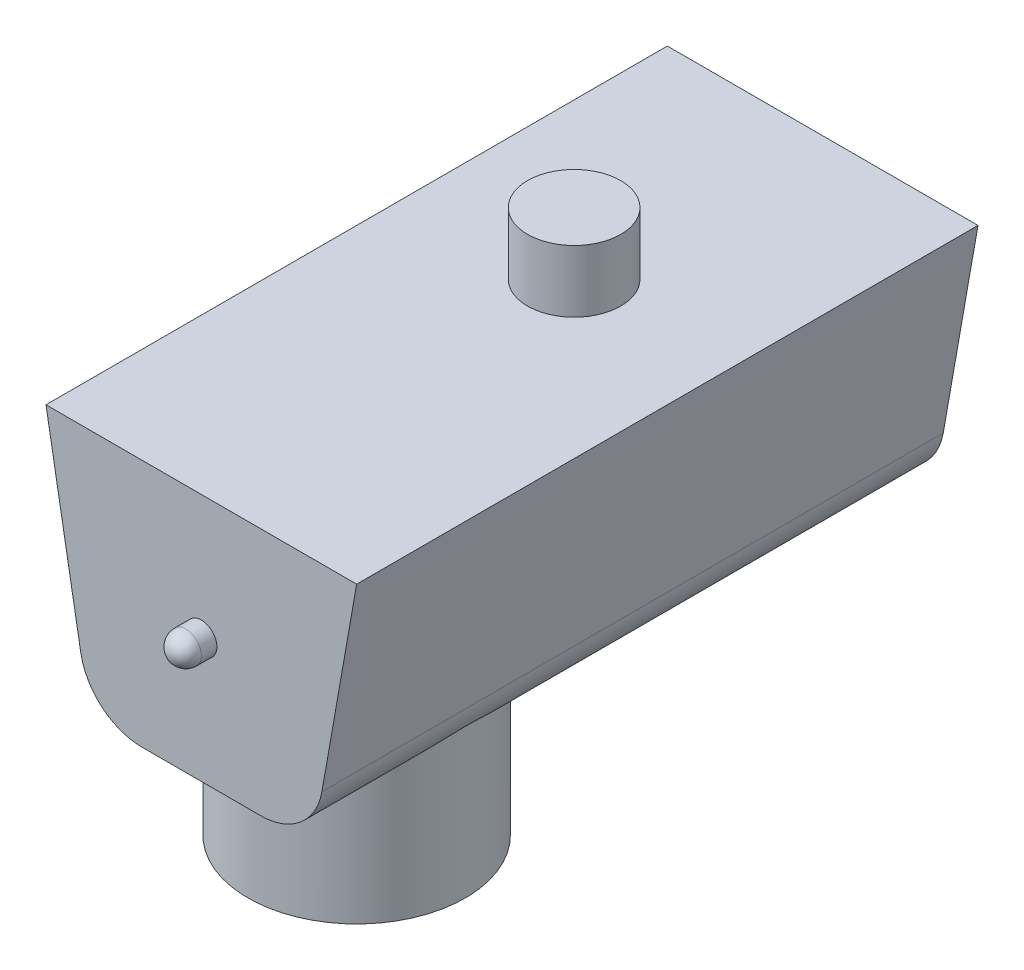
ISO-10303-21;
HEADER;
FILE_DESCRIPTION(('STEP AP214'),'2;1');
FILE_NAME('part.step','',(''),(''),'','','');
FILE_SCHEMA(('AUTOMOTIVE_DESIGN { 1 0 10303 214 1 1 1 1 }'));
ENDSEC;
DATA;
#1=APPLICATION_CONTEXT('core data for automotive mechanical design processes');
#2=APPLICATION_PROTOCOL_DEFINITION('international standard','automotive_design',2000,#1);
#3=PRODUCT_CONTEXT('',#1,'mechanical');
#4=PRODUCT('Part','Part','',(#3));
#5=PRODUCT_RELATED_PRODUCT_CATEGORY('part','',(#4));
#6=PRODUCT_DEFINITION_FORMATION('','',#4);
#7=PRODUCT_DEFINITION_CONTEXT('part definition',#1,'design');
#8=PRODUCT_DEFINITION('design','',#6,#7);
#9=PRODUCT_DEFINITION_SHAPE('','',#8);
#10=(LENGTH_UNIT() NAMED_UNIT(*) SI_UNIT(.MILLI.,.METRE.));
#11=(NAMED_UNIT(*) PLANE_ANGLE_UNIT() SI_UNIT($,.RADIAN.));
#12=(NAMED_UNIT(*) SI_UNIT($,.STERADIAN.) SOLID_ANGLE_UNIT());
#13=UNCERTAINTY_MEASURE_WITH_UNIT(LENGTH_MEASURE(1.E-05),#10,'distance_accuracy_value','');
#14=(GEOMETRIC_REPRESENTATION_CONTEXT(3) GLOBAL_UNCERTAINTY_ASSIGNED_CONTEXT((#13)) GLOBAL_UNIT_ASSIGNED_CONTEXT((#10,
#11,#12)) REPRESENTATION_CONTEXT('',''));
#15=CARTESIAN_POINT('',(0.,0.,0.));
#16=DIRECTION('',(0.,0.,1.));
#17=DIRECTION('',(1.,0.,0.));
#18=AXIS2_PLACEMENT_3D('',#15,#16,#17);
#19=CARTESIAN_POINT('',(0.,-4.,1.));
#20=DIRECTION('',(0.,0.,-1.));
#21=DIRECTION('',(-1.,0.,0.));
#22=AXIS2_PLACEMENT_3D('',#19,#20,#21);
#23=CYLINDRICAL_SURFACE('',#22,0.5);
#24=CARTESIAN_POINT('',(0.,-4.,0.5));
#25=DIRECTION('',(0.,0.,-1.));
#26=DIRECTION('',(-1.,0.,0.));
#27=AXIS2_PLACEMENT_3D('',#24,#25,#26);
#28=CIRCLE('',#27,0.5);
#29=CARTESIAN_POINT('',(-0.499999999999999,-4.,0.5));
#30=VERTEX_POINT('',#29);
#31=EDGE_CURVE('E11',#30,#30,#28,.T.);
#32=ORIENTED_EDGE('',*,*,#31,.T.);
#33=EDGE_LOOP('',(#32));
#34=FACE_BOUND('',#33,.T.);
#35=CARTESIAN_POINT('',(0.,-4.,0.));
#36=DIRECTION('',(0.,0.,1.));
#37=DIRECTION('',(1.,0.,0.));
#38=AXIS2_PLACEMENT_3D('',#35,#36,#37);
#39=CIRCLE('',#38,0.5);
#40=CARTESIAN_POINT('',(0.500000000000001,-4.,0.));
#41=VERTEX_POINT('',#40);
#42=EDGE_CURVE('E56',#41,#41,#39,.T.);
#43=ORIENTED_EDGE('',*,*,#42,.T.);
#44=EDGE_LOOP('',(#43));
#45=FACE_BOUND('',#44,.T.);
#46=ADVANCED_FACE('F49',(#34,#45),#23,.T.);
#47=CARTESIAN_POINT('',(0.,0.,0.));
#48=DIRECTION('',(0.,0.,1.));
#49=DIRECTION('',(1.,0.,0.));
#50=AXIS2_PLACEMENT_3D('',#47,#48,#49);
#51=PLANE('',#50);
#52=ORIENTED_EDGE('',*,*,#42,.F.);
#53=EDGE_LOOP('',(#52));
#54=FACE_BOUND('',#53,.T.);
#55=ADVANCED_FACE('F63',(#54),#51,.F.);
#56=CARTESIAN_POINT('',(0.,-4.,0.5));
#57=DIRECTION('',(0.,0.,1.));
#58=DIRECTION('',(1.,0.,0.));
#59=AXIS2_PLACEMENT_3D('',#56,#57,#58);
#60=SPHERICAL_SURFACE('',#59,0.5);
#61=ORIENTED_EDGE('',*,*,#31,.F.);
#62=EDGE_LOOP('',(#61));
#63=FACE_BOUND('',#62,.T.);
#64=ADVANCED_FACE('F51',(#63),#60,.T.);
#65=CLOSED_SHELL('',(#46,#55,#64));
#66=MANIFOLD_SOLID_BREP('B2',#65);
#67=CARTESIAN_POINT('',(-1.91118489197773,-8.,-20.));
#68=DIRECTION('',(0.,-1.,0.));
#69=DIRECTION('',(0.,0.,-1.));
#70=AXIS2_PLACEMENT_3D('',#67,#68,#69);
#71=PLANE('',#70);
#72=CARTESIAN_POINT('',(0.,-8.,-5.));
#73=DIRECTION('',(0.,-1.,0.));
#74=DIRECTION('',(0.,0.,-1.));
#75=AXIS2_PLACEMENT_3D('',#72,#73,#74);
#76=CIRCLE('',#75,3.5);
#77=CARTESIAN_POINT('',(1.91118489197773,-8.,-2.06787239215684));
#78=VERTEX_POINT('',#77);
#79=CARTESIAN_POINT('',(-1.91118489197773,-8.,-2.06787239215684));
#80=VERTEX_POINT('',#79);
#81=EDGE_CURVE('E111',#78,#80,#76,.T.);
#82=ORIENTED_EDGE('',*,*,#81,.F.);
#83=DIRECTION('',(0.,0.,1.));
#84=VECTOR('',#83,1.);
#85=CARTESIAN_POINT('',(1.91118489197773,-8.,-20.));
#86=LINE('',#85,#84);
#87=CARTESIAN_POINT('',(1.91118489197773,-8.,0.));
#88=VERTEX_POINT('',#87);
#89=EDGE_CURVE('E196',#78,#88,#86,.T.);
#90=ORIENTED_EDGE('',*,*,#89,.T.);
#91=DIRECTION('',(1.,0.,0.));
#92=VECTOR('',#91,1.);
#93=CARTESIAN_POINT('',(-1.91118489197773,-8.,0.));
#94=LINE('',#93,#92);
#95=CARTESIAN_POINT('',(-1.91118489197773,-8.,0.));
#96=VERTEX_POINT('',#95);
#97=EDGE_CURVE('E285',#96,#88,#94,.T.);
#98=ORIENTED_EDGE('',*,*,#97,.F.);
#99=DIRECTION('',(0.,0.,1.));
#100=VECTOR('',#99,1.);
#101=CARTESIAN_POINT('',(-1.91118489197773,-8.,-20.));
#102=LINE('',#101,#100);
#103=EDGE_CURVE('E194',#80,#96,#102,.T.);
#104=ORIENTED_EDGE('',*,*,#103,.F.);
#105=EDGE_LOOP('',(#82,#90,#98,#104));
#106=FACE_BOUND('',#105,.T.);
#107=ADVANCED_FACE('F90',(#106),#71,.T.);
#108=CARTESIAN_POINT('',(3.88080039800216,-6.34729635533384,-20.));
#109=DIRECTION('',(0.984807753012209,-0.173648177666927,0.));
#110=DIRECTION('',(0.173648177666927,0.984807753012209,0.));
#111=AXIS2_PLACEMENT_3D('',#108,#109,#110);
#112=PLANE('',#111);
#113=DIRECTION('',(0.173648177666927,0.984807753012209,0.));
#114=VECTOR('',#113,1.);
#115=CARTESIAN_POINT('',(3.88080039800216,-6.34729635533384,0.));
#116=LINE('',#115,#114);
#117=CARTESIAN_POINT('',(3.88080039800216,-6.34729635533384,0.));
#118=VERTEX_POINT('',#117);
#119=CARTESIAN_POINT('',(5.,0.,0.));
#120=VERTEX_POINT('',#119);
#121=EDGE_CURVE('E253',#118,#120,#116,.T.);
#122=ORIENTED_EDGE('',*,*,#121,.F.);
#123=DIRECTION('',(0.,0.,1.));
#124=VECTOR('',#123,1.);
#125=CARTESIAN_POINT('',(3.88080039800216,-6.34729635533384,-20.));
#126=LINE('',#125,#124);
#127=CARTESIAN_POINT('',(3.88080039800216,-6.34729635533384,-20.));
#128=VERTEX_POINT('',#127);
#129=EDGE_CURVE('E183',#128,#118,#126,.T.);
#130=ORIENTED_EDGE('',*,*,#129,.F.);
#131=DIRECTION('',(0.173648177666927,0.984807753012209,0.));
#132=VECTOR('',#131,1.);
#133=CARTESIAN_POINT('',(3.88080039800216,-6.34729635533384,-20.));
#134=LINE('',#133,#132);
#135=CARTESIAN_POINT('',(5.,0.,-20.));
#136=VERTEX_POINT('',#135);
#137=EDGE_CURVE('E256',#128,#136,#134,.T.);
#138=ORIENTED_EDGE('',*,*,#137,.T.);
#139=DIRECTION('',(0.,0.,1.));
#140=VECTOR('',#139,1.);
#141=CARTESIAN_POINT('',(5.,0.,-20.));
#142=LINE('',#141,#140);
#143=EDGE_CURVE('E205',#136,#120,#142,.T.);
#144=ORIENTED_EDGE('',*,*,#143,.T.);
#145=EDGE_LOOP('',(#122,#130,#138,#144));
#146=FACE_BOUND('',#145,.T.);
#147=ADVANCED_FACE('F92',(#146),#112,.T.);
#148=CARTESIAN_POINT('',(1.91118489197774,-6.,-20.));
#149=DIRECTION('',(0.,0.,1.));
#150=DIRECTION('',(1.,0.,0.));
#151=AXIS2_PLACEMENT_3D('',#148,#149,#150);
#152=CYLINDRICAL_SURFACE('',#151,2.);
#153=CARTESIAN_POINT('',(1.91118489197773,-8.,-7.93212760784317));
#154=CARTESIAN_POINT('',(1.98358799506988,-7.99999929424011,-7.8849646808693));
#155=CARTESIAN_POINT('',(2.05412557252914,-7.99607170451609,-7.83513982459404));
#156=CARTESIAN_POINT('',(2.19074387768691,-7.98155247196233,-7.73092554150598));
#157=CARTESIAN_POINT('',(2.25683585304358,-7.97097840573854,-7.67654848074));
#158=CARTESIAN_POINT('',(2.38344807204189,-7.9445058545928,-7.564421439919));
#159=CARTESIAN_POINT('',(2.44402639521548,-7.9286738190078,-7.50672063358744));
#160=CARTESIAN_POINT('',(2.56032747071847,-7.89270206334381,-7.38781125262578));
#161=CARTESIAN_POINT('',(2.61604657190707,-7.8725591427248,-7.32660009665203));
#162=CARTESIAN_POINT('',(2.73328234191226,-7.82453861845805,-7.18837052087008));
#163=CARTESIAN_POINT('',(2.79368299904256,-7.79592085985095,-7.1106639522529));
#164=CARTESIAN_POINT('',(2.90723045284817,-7.73551987853734,-6.95130426712442));
#165=CARTESIAN_POINT('',(2.96037630636037,-7.70373624517754,-6.86965063933938));
#166=CARTESIAN_POINT('',(3.05972330760307,-7.63841630169307,-6.702239746868));
#167=CARTESIAN_POINT('',(3.10588577523502,-7.6048715235807,-6.61646286281092));
#168=CARTESIAN_POINT('',(3.19091624615944,-7.5379274049331,-6.44136059621658));
#169=CARTESIAN_POINT('',(3.22978601116677,-7.50452803118146,-6.3520360770237));
#170=CARTESIAN_POINT('',(3.31795178863783,-7.42342783755891,-6.12376422163606));
#171=CARTESIAN_POINT('',(3.36261703828588,-7.37701118021476,-5.98251378491226));
#172=CARTESIAN_POINT('',(3.43404785502108,-7.29760433198984,-5.69240350088643));
#173=CARTESIAN_POINT('',(3.46090586880833,-7.26454515091273,-5.54358734208319));
#174=CARTESIAN_POINT('',(3.49190487007958,-7.22550477168379,-5.26835191435162));
#175=CARTESIAN_POINT('',(3.49933512104774,-7.21563882580685,-5.14289739868689));
#176=CARTESIAN_POINT('',(3.50057875700142,-7.21401413891001,-4.89182582332128));
#177=CARTESIAN_POINT('',(3.49439575283645,-7.22225059631494,-4.76620881555346));
#178=CARTESIAN_POINT('',(3.46569738697379,-7.25861691282281,-4.48669892121598));
#179=CARTESIAN_POINT('',(3.43939346727387,-7.29131479895575,-4.33383469672536));
#180=CARTESIAN_POINT('',(3.36811342208995,-7.37119449467568,-4.03587321645681));
#181=CARTESIAN_POINT('',(3.32302335880622,-7.41846421935747,-3.89082956109688));
#182=CARTESIAN_POINT('',(3.23258152838831,-7.50214265106308,-3.65430062606489));
#183=CARTESIAN_POINT('',(3.19190289651856,-7.53720498274705,-3.56049167957574));
#184=CARTESIAN_POINT('',(3.10251168768437,-7.60747218833978,-3.37677342374652));
#185=CARTESIAN_POINT('',(3.05379649889373,-7.64267710494742,-3.28686539421508));
#186=CARTESIAN_POINT('',(2.9486500025673,-7.71101721297381,-3.11165763123688));
#187=CARTESIAN_POINT('',(2.89226643680235,-7.7441634940457,-3.02633361610787));
#188=CARTESIAN_POINT('',(2.77151789442627,-7.80677898177201,-2.86008557708139));
#189=CARTESIAN_POINT('',(2.70715535492474,-7.8362493057258,-2.77916022046136));
#190=CARTESIAN_POINT('',(2.58719089252604,-7.88310630567182,-2.64147912696994));
#191=CARTESIAN_POINT('',(2.53328828725158,-7.90168633611877,-2.58364737280702));
#192=CARTESIAN_POINT('',(2.4210854081335,-7.93479214658057,-2.4712357137426));
#193=CARTESIAN_POINT('',(2.36278831213217,-7.94932082124396,-2.41665350911807));
#194=CARTESIAN_POINT('',(2.241261842715,-7.97355774568699,-2.31051777160011));
#195=CARTESIAN_POINT('',(2.17798242512052,-7.98320714867982,-2.2590075292425));
#196=CARTESIAN_POINT('',(2.04743108283241,-7.99643552394319,-2.16014299038981));
#197=CARTESIAN_POINT('',(1.98014997535747,-7.99999992920589,-2.11279892339922));
#198=CARTESIAN_POINT('',(1.91118489197773,-8.00000000000001,-2.06787239215684));
#199=B_SPLINE_CURVE_WITH_KNOTS('',3,(#153,#154,#155,#156,#157,#158,#159,#160,#161,#162,#163,
#164,#165,#166,#167,#168,#169,#170,#171,#172,#173,#174,#175,#176,#177,#178,#179,#180,#181,#182,
#183,#184,#185,#186,#187,#188,#189,#190,#191,#192,#193,#194,#195,#196,#197,#198),.UNSPECIFIED.,
.F.,.F.,(4,2,2,2,2,2,2,2,2,2,2,2,2,2,2,2,2,2,2,2,2,2,4),(0.,0.25892030118102,0.517158751901072,
0.772250506087775,1.02753230971939,1.33458757432497,1.6416827198096,1.95042101869072,
2.25908463865253,2.72344399261823,3.18537333311091,3.56163484346092,3.93779656430451,
4.4106182175377,4.88635026511816,5.21030344006054,5.5343621057374,5.85648847322114,
6.17851669125361,6.42189869248425,6.66510635180954,6.91118116715639,7.15784424453554),.UNSPECIFIED.);
#200=CARTESIAN_POINT('',(1.91118489197773,-8.,-7.93212760784317));
#201=VERTEX_POINT('',#200);
#202=EDGE_CURVE('E118',#201,#78,#199,.T.);
#203=ORIENTED_EDGE('',*,*,#202,.F.);
#204=CARTESIAN_POINT('',(1.91118489197773,-8.,-20.));
#205=VERTEX_POINT('',#204);
#206=EDGE_CURVE('E200',#205,#201,#86,.T.);
#207=ORIENTED_EDGE('',*,*,#206,.F.);
#208=CARTESIAN_POINT('',(1.91118489197774,-6.,-20.));
#209=DIRECTION('',(0.,0.,1.));
#210=DIRECTION('',(1.,0.,0.));
#211=AXIS2_PLACEMENT_3D('',#208,#209,#210);
#212=CIRCLE('',#211,2.);
#213=EDGE_CURVE('E206',#205,#128,#212,.T.);
#214=ORIENTED_EDGE('',*,*,#213,.T.);
#215=ORIENTED_EDGE('',*,*,#129,.T.);
#216=CARTESIAN_POINT('',(1.91118489197774,-6.,0.));
#217=DIRECTION('',(0.,0.,1.));
#218=DIRECTION('',(1.,0.,0.));
#219=AXIS2_PLACEMENT_3D('',#216,#217,#218);
#220=CIRCLE('',#219,2.);
#221=EDGE_CURVE('E260',#88,#118,#220,.T.);
#222=ORIENTED_EDGE('',*,*,#221,.F.);
#223=ORIENTED_EDGE('',*,*,#89,.F.);
#224=EDGE_LOOP('',(#203,#207,#214,#215,#222,#223));
#225=FACE_BOUND('',#224,.T.);
#226=ADVANCED_FACE('F235',(#225),#152,.T.);
#227=CARTESIAN_POINT('',(-1.91118489197773,-8.,-7.93212760784317));
#228=VERTEX_POINT('',#227);
#229=EDGE_CURVE('E232',#228,#201,#76,.T.);
#230=ORIENTED_EDGE('',*,*,#229,.F.);
#231=CARTESIAN_POINT('',(-1.91118489197773,-8.,-20.));
#232=VERTEX_POINT('',#231);
#233=EDGE_CURVE('E193',#232,#228,#102,.T.);
#234=ORIENTED_EDGE('',*,*,#233,.F.);
#235=DIRECTION('',(1.,0.,0.));
#236=VECTOR('',#235,1.);
#237=CARTESIAN_POINT('',(-1.91118489197773,-8.,-20.));
#238=LINE('',#237,#236);
#239=EDGE_CURVE('E269',#232,#205,#238,.T.);
#240=ORIENTED_EDGE('',*,*,#239,.T.);
#241=ORIENTED_EDGE('',*,*,#206,.T.);
#242=EDGE_LOOP('',(#230,#234,#240,#241));
#243=FACE_BOUND('',#242,.T.);
#244=ADVANCED_FACE('F239',(#243),#71,.T.);
#245=CARTESIAN_POINT('',(-1.91118489197774,-6.,-20.));
#246=DIRECTION('',(0.,0.,1.));
#247=DIRECTION('',(1.,0.,0.));
#248=AXIS2_PLACEMENT_3D('',#245,#246,#247);
#249=CYLINDRICAL_SURFACE('',#248,2.);
#250=CARTESIAN_POINT('',(-1.91118489197773,-8.,-2.06787239215684));
#251=CARTESIAN_POINT('',(-1.98358799506988,-7.99999929424011,-2.1150353191307));
#252=CARTESIAN_POINT('',(-2.05412557252914,-7.99607170451609,-2.16486017540597));
#253=CARTESIAN_POINT('',(-2.19074387768691,-7.98155247196233,-2.26907445849403));
#254=CARTESIAN_POINT('',(-2.25683585304358,-7.97097840573854,-2.32345151926));
#255=CARTESIAN_POINT('',(-2.38344807204189,-7.9445058545928,-2.435578560081));
#256=CARTESIAN_POINT('',(-2.44402639521548,-7.9286738190078,-2.49327936641257));
#257=CARTESIAN_POINT('',(-2.56032747071847,-7.89270206334381,-2.61218874737423));
#258=CARTESIAN_POINT('',(-2.61604657190707,-7.8725591427248,-2.67339990334798));
#259=CARTESIAN_POINT('',(-2.73328234191226,-7.82453861845805,-2.81162947912993));
#260=CARTESIAN_POINT('',(-2.79368299904256,-7.79592085985095,-2.8893360477471));
#261=CARTESIAN_POINT('',(-2.90723045284817,-7.73551987853734,-3.04869573287558));
#262=CARTESIAN_POINT('',(-2.96037630636037,-7.70373624517754,-3.13034936066062));
#263=CARTESIAN_POINT('',(-3.05972330760307,-7.63841630169307,-3.297760253132));
#264=CARTESIAN_POINT('',(-3.10588577523503,-7.6048715235807,-3.38353713718908));
#265=CARTESIAN_POINT('',(-3.19091624615944,-7.5379274049331,-3.55863940378342));
#266=CARTESIAN_POINT('',(-3.22978601116677,-7.50452803118146,-3.64796392297631));
#267=CARTESIAN_POINT('',(-3.31795178863783,-7.42342783755891,-3.87623577836394));
#268=CARTESIAN_POINT('',(-3.36261703828588,-7.37701118021476,-4.01748621508774));
#269=CARTESIAN_POINT('',(-3.43404785502108,-7.29760433198984,-4.30759649911358));
#270=CARTESIAN_POINT('',(-3.46090586880833,-7.26454515091273,-4.45641265791681));
#271=CARTESIAN_POINT('',(-3.49190487007958,-7.2255047716838,-4.73164808564839));
#272=CARTESIAN_POINT('',(-3.49933512104774,-7.21563882580685,-4.85710260131312));
#273=CARTESIAN_POINT('',(-3.50057875700142,-7.21401413891001,-5.10817417667872));
#274=CARTESIAN_POINT('',(-3.49439575283645,-7.22225059631494,-5.23379118444655));
#275=CARTESIAN_POINT('',(-3.46569738697379,-7.25861691282281,-5.51330107878402));
#276=CARTESIAN_POINT('',(-3.43939346727387,-7.29131479895576,-5.66616530327465));
#277=CARTESIAN_POINT('',(-3.36811342208995,-7.37119449467569,-5.9641267835432));
#278=CARTESIAN_POINT('',(-3.32302335880622,-7.41846421935748,-6.10917043890313));
#279=CARTESIAN_POINT('',(-3.23258152838831,-7.50214265106308,-6.34569937393512));
#280=CARTESIAN_POINT('',(-3.19190289651855,-7.53720498274706,-6.43950832042427));
#281=CARTESIAN_POINT('',(-3.10251168768437,-7.60747218833979,-6.62322657625349));
#282=CARTESIAN_POINT('',(-3.05379649889373,-7.64267710494743,-6.71313460578493));
#283=CARTESIAN_POINT('',(-2.94865000256729,-7.71101721297382,-6.88834236876313));
#284=CARTESIAN_POINT('',(-2.89226643680235,-7.7441634940457,-6.97366638389214));
#285=CARTESIAN_POINT('',(-2.77151789442627,-7.80677898177201,-7.13991442291862));
#286=CARTESIAN_POINT('',(-2.70715535492474,-7.8362493057258,-7.22083977953865));
#287=CARTESIAN_POINT('',(-2.58719089252604,-7.88310630567182,-7.35852087303007));
#288=CARTESIAN_POINT('',(-2.53328828725158,-7.90168633611877,-7.41635262719299));
#289=CARTESIAN_POINT('',(-2.42108540813349,-7.93479214658057,-7.5287642862574));
#290=CARTESIAN_POINT('',(-2.36278831213217,-7.94932082124396,-7.58334649088194));
#291=CARTESIAN_POINT('',(-2.241261842715,-7.97355774568699,-7.68948222839989));
#292=CARTESIAN_POINT('',(-2.17798242512052,-7.98320714867982,-7.74099247075751));
#293=CARTESIAN_POINT('',(-2.04743108283241,-7.99643552394318,-7.83985700961019));
#294=CARTESIAN_POINT('',(-1.98014997535748,-7.99999992920589,-7.88720107660078));
#295=CARTESIAN_POINT('',(-1.91118489197773,-8.00000000000001,-7.93212760784317));
#296=B_SPLINE_CURVE_WITH_KNOTS('',3,(#250,#251,#252,#253,#254,#255,#256,#257,#258,#259,#260,
#261,#262,#263,#264,#265,#266,#267,#268,#269,#270,#271,#272,#273,#274,#275,#276,#277,#278,#279,
#280,#281,#282,#283,#284,#285,#286,#287,#288,#289,#290,#291,#292,#293,#294,#295),.UNSPECIFIED.,
.F.,.F.,(4,2,2,2,2,2,2,2,2,2,2,2,2,2,2,2,2,2,2,2,2,2,4),(0.,0.258920301181019,0.517158751901072,
0.772250506087775,1.02753230971939,1.33458757432497,1.6416827198096,1.95042101869072,
2.25908463865253,2.72344399261823,3.18537333311091,3.56163484346092,3.93779656430451,
4.41061821753771,4.88635026511816,5.21030344006055,5.5343621057374,5.85648847322115,
6.17851669125361,6.42189869248425,6.66510635180954,6.91118116715638,7.15784424453554),.UNSPECIFIED.);
#297=EDGE_CURVE('E47',#80,#228,#296,.T.);
#298=ORIENTED_EDGE('',*,*,#297,.F.);
#299=ORIENTED_EDGE('',*,*,#103,.T.);
#300=CARTESIAN_POINT('',(-1.91118489197774,-6.,0.));
#301=DIRECTION('',(0.,0.,1.));
#302=DIRECTION('',(1.,0.,0.));
#303=AXIS2_PLACEMENT_3D('',#300,#301,#302);
#304=CIRCLE('',#303,2.);
#305=CARTESIAN_POINT('',(-3.88080039800216,-6.34729635533384,0.));
#306=VERTEX_POINT('',#305);
#307=EDGE_CURVE('E282',#306,#96,#304,.T.);
#308=ORIENTED_EDGE('',*,*,#307,.F.);
#309=DIRECTION('',(0.,0.,1.));
#310=VECTOR('',#309,1.);
#311=CARTESIAN_POINT('',(-3.88080039800216,-6.34729635533384,-20.));
#312=LINE('',#311,#310);
#313=CARTESIAN_POINT('',(-3.88080039800216,-6.34729635533384,-20.));
#314=VERTEX_POINT('',#313);
#315=EDGE_CURVE('E197',#314,#306,#312,.T.);
#316=ORIENTED_EDGE('',*,*,#315,.F.);
#317=CARTESIAN_POINT('',(-1.91118489197774,-6.,-20.));
#318=DIRECTION('',(0.,0.,1.));
#319=DIRECTION('',(1.,0.,0.));
#320=AXIS2_PLACEMENT_3D('',#317,#318,#319);
#321=CIRCLE('',#320,2.);
#322=EDGE_CURVE('E266',#314,#232,#321,.T.);
#323=ORIENTED_EDGE('',*,*,#322,.T.);
#324=ORIENTED_EDGE('',*,*,#233,.T.);
#325=EDGE_LOOP('',(#298,#299,#308,#316,#323,#324));
#326=FACE_BOUND('',#325,.T.);
#327=ADVANCED_FACE('F212',(#326),#249,.T.);
#328=CARTESIAN_POINT('',(-5.,0.,-20.));
#329=DIRECTION('',(-0.984807753012209,-0.173648177666927,0.));
#330=DIRECTION('',(0.173648177666927,-0.984807753012209,0.));
#331=AXIS2_PLACEMENT_3D('',#328,#329,#330);
#332=PLANE('',#331);
#333=DIRECTION('',(0.173648177666927,-0.984807753012209,0.));
#334=VECTOR('',#333,1.);
#335=CARTESIAN_POINT('',(-5.,0.,0.));
#336=LINE('',#335,#334);
#337=CARTESIAN_POINT('',(-5.,0.,0.));
#338=VERTEX_POINT('',#337);
#339=EDGE_CURVE('E279',#338,#306,#336,.T.);
#340=ORIENTED_EDGE('',*,*,#339,.F.);
#341=DIRECTION('',(0.,0.,1.));
#342=VECTOR('',#341,1.);
#343=CARTESIAN_POINT('',(-5.,0.,-20.));
#344=LINE('',#343,#342);
#345=CARTESIAN_POINT('',(-5.,0.,-20.));
#346=VERTEX_POINT('',#345);
#347=EDGE_CURVE('E203',#346,#338,#344,.T.);
#348=ORIENTED_EDGE('',*,*,#347,.F.);
#349=DIRECTION('',(0.173648177666927,-0.984807753012209,0.));
#350=VECTOR('',#349,1.);
#351=CARTESIAN_POINT('',(-5.,0.,-20.));
#352=LINE('',#351,#350);
#353=EDGE_CURVE('E263',#346,#314,#352,.T.);
#354=ORIENTED_EDGE('',*,*,#353,.T.);
#355=ORIENTED_EDGE('',*,*,#315,.T.);
#356=EDGE_LOOP('',(#340,#348,#354,#355));
#357=FACE_BOUND('',#356,.T.);
#358=ADVANCED_FACE('F314',(#357),#332,.T.);
#359=CARTESIAN_POINT('',(-5.,0.,-20.));
#360=DIRECTION('',(0.,1.,0.));
#361=DIRECTION('',(-1.,0.,0.));
#362=AXIS2_PLACEMENT_3D('',#359,#360,#361);
#363=PLANE('',#362);
#364=CARTESIAN_POINT('',(0.,0.,-12.));
#365=DIRECTION('',(0.,1.,0.));
#366=DIRECTION('',(-1.,0.,0.));
#367=AXIS2_PLACEMENT_3D('',#364,#365,#366);
#368=CIRCLE('',#367,1.5);
#369=CARTESIAN_POINT('',(-1.5,0.,-12.));
#370=VERTEX_POINT('',#369);
#371=EDGE_CURVE('E351',#370,#370,#368,.T.);
#372=ORIENTED_EDGE('',*,*,#371,.F.);
#373=EDGE_LOOP('',(#372));
#374=FACE_BOUND('',#373,.T.);
#375=DIRECTION('',(-1.,0.,0.));
#376=VECTOR('',#375,1.);
#377=CARTESIAN_POINT('',(-5.,0.,0.));
#378=LINE('',#377,#376);
#379=EDGE_CURVE('E276',#120,#338,#378,.T.);
#380=ORIENTED_EDGE('',*,*,#379,.F.);
#381=ORIENTED_EDGE('',*,*,#143,.F.);
#382=DIRECTION('',(-1.,0.,0.));
#383=VECTOR('',#382,1.);
#384=CARTESIAN_POINT('',(-5.,0.,-20.));
#385=LINE('',#384,#383);
#386=EDGE_CURVE('E259',#136,#346,#385,.T.);
#387=ORIENTED_EDGE('',*,*,#386,.T.);
#388=ORIENTED_EDGE('',*,*,#347,.T.);
#389=EDGE_LOOP('',(#380,#381,#387,#388));
#390=FACE_BOUND('',#389,.T.);
#391=ADVANCED_FACE('F312',(#374,#390),#363,.T.);
#392=CARTESIAN_POINT('',(-1.91118489197774,-6.,-20.));
#393=DIRECTION('',(0.,0.,1.));
#394=DIRECTION('',(1.,0.,0.));
#395=AXIS2_PLACEMENT_3D('',#392,#393,#394);
#396=PLANE('',#395);
#397=CARTESIAN_POINT('',(0.,-4.,-20.));
#398=DIRECTION('',(0.,0.,1.));
#399=DIRECTION('',(1.,0.,0.));
#400=AXIS2_PLACEMENT_3D('',#397,#398,#399);
#401=CIRCLE('',#400,0.5);
#402=CARTESIAN_POINT('',(0.500000000000001,-4.,-20.));
#403=VERTEX_POINT('',#402);
#404=EDGE_CURVE('E250',#403,#403,#401,.T.);
#405=ORIENTED_EDGE('',*,*,#404,.T.);
#406=EDGE_LOOP('',(#405));
#407=FACE_BOUND('',#406,.T.);
#408=ORIENTED_EDGE('',*,*,#137,.F.);
#409=ORIENTED_EDGE('',*,*,#213,.F.);
#410=ORIENTED_EDGE('',*,*,#239,.F.);
#411=ORIENTED_EDGE('',*,*,#322,.F.);
#412=ORIENTED_EDGE('',*,*,#353,.F.);
#413=ORIENTED_EDGE('',*,*,#386,.F.);
#414=EDGE_LOOP('',(#408,#409,#410,#411,#412,#413));
#415=FACE_BOUND('',#414,.T.);
#416=ADVANCED_FACE('F306',(#407,#415),#396,.F.);
#417=CARTESIAN_POINT('',(-1.91118489197774,-6.,0.));
#418=DIRECTION('',(0.,0.,1.));
#419=DIRECTION('',(1.,0.,0.));
#420=AXIS2_PLACEMENT_3D('',#417,#418,#419);
#421=PLANE('',#420);
#422=CARTESIAN_POINT('',(0.,-4.,0.));
#423=DIRECTION('',(0.,0.,1.));
#424=DIRECTION('',(1.,0.,0.));
#425=AXIS2_PLACEMENT_3D('',#422,#423,#424);
#426=CIRCLE('',#425,0.5);
#427=CARTESIAN_POINT('',(0.500000000000001,-4.,0.));
#428=VERTEX_POINT('',#427);
#429=EDGE_CURVE('E249',#428,#428,#426,.T.);
#430=ORIENTED_EDGE('',*,*,#429,.F.);
#431=EDGE_LOOP('',(#430));
#432=FACE_BOUND('',#431,.T.);
#433=ORIENTED_EDGE('',*,*,#121,.T.);
#434=ORIENTED_EDGE('',*,*,#379,.T.);
#435=ORIENTED_EDGE('',*,*,#339,.T.);
#436=ORIENTED_EDGE('',*,*,#307,.T.);
#437=ORIENTED_EDGE('',*,*,#97,.T.);
#438=ORIENTED_EDGE('',*,*,#221,.T.);
#439=EDGE_LOOP('',(#433,#434,#435,#436,#437,#438));
#440=FACE_BOUND('',#439,.T.);
#441=ADVANCED_FACE('F241',(#432,#440),#421,.T.);
#442=CARTESIAN_POINT('',(0.,-4.,-20.));
#443=DIRECTION('',(0.,0.,1.));
#444=DIRECTION('',(1.,0.,0.));
#445=AXIS2_PLACEMENT_3D('',#442,#443,#444);
#446=CYLINDRICAL_SURFACE('',#445,0.5);
#447=ORIENTED_EDGE('',*,*,#404,.F.);
#448=EDGE_LOOP('',(#447));
#449=FACE_BOUND('',#448,.T.);
#450=ORIENTED_EDGE('',*,*,#429,.T.);
#451=EDGE_LOOP('',(#450));
#452=FACE_BOUND('',#451,.T.);
#453=ADVANCED_FACE('F392',(#449,#452),#446,.F.);
#454=CARTESIAN_POINT('',(0.,-6.,-5.));
#455=DIRECTION('',(0.,-1.,0.));
#456=DIRECTION('',(0.,0.,-1.));
#457=AXIS2_PLACEMENT_3D('',#454,#455,#456);
#458=CYLINDRICAL_SURFACE('',#457,3.5);
#459=ORIENTED_EDGE('',*,*,#229,.T.);
#460=ORIENTED_EDGE('',*,*,#202,.T.);
#461=ORIENTED_EDGE('',*,*,#81,.T.);
#462=ORIENTED_EDGE('',*,*,#297,.T.);
#463=EDGE_LOOP('',(#459,#460,#461,#462));
#464=FACE_BOUND('',#463,.T.);
#465=CARTESIAN_POINT('',(0.,-12.,-5.));
#466=DIRECTION('',(0.,-1.,0.));
#467=DIRECTION('',(0.,0.,-1.));
#468=AXIS2_PLACEMENT_3D('',#465,#466,#467);
#469=CIRCLE('',#468,3.5);
#470=CARTESIAN_POINT('',(0.,-12.,-8.5));
#471=VERTEX_POINT('',#470);
#472=EDGE_CURVE('E344',#471,#471,#469,.T.);
#473=ORIENTED_EDGE('',*,*,#472,.F.);
#474=EDGE_LOOP('',(#473));
#475=FACE_BOUND('',#474,.T.);
#476=ADVANCED_FACE('F220',(#464,#475),#458,.T.);
#477=CARTESIAN_POINT('',(0.,-6.,-5.));
#478=DIRECTION('',(0.,-1.,0.));
#479=DIRECTION('',(0.,0.,-1.));
#480=AXIS2_PLACEMENT_3D('',#477,#478,#479);
#481=CYLINDRICAL_SURFACE('',#480,3.);
#482=CARTESIAN_POINT('',(1.91118489197773,-8.,-7.31243860646636));
#483=CARTESIAN_POINT('',(1.97747930460981,-7.99999472992216,-7.25767237981306));
#484=CARTESIAN_POINT('',(2.04131359868537,-7.99670644777238,-7.20009509201302));
#485=CARTESIAN_POINT('',(2.16347440294235,-7.98497112766138,-7.08006355220657));
#486=CARTESIAN_POINT('',(2.22181167110061,-7.97653441814571,-7.01761928224627));
#487=CARTESIAN_POINT('',(2.33238296786808,-7.95594984132935,-6.88869755583463));
#488=CARTESIAN_POINT('',(2.38464601480044,-7.94382071361641,-6.82224179314653));
#489=CARTESIAN_POINT('',(2.48319526691347,-7.91713633738106,-6.68548129406014));
#490=CARTESIAN_POINT('',(2.52947884389262,-7.90258002841691,-6.61517488436004));
#491=CARTESIAN_POINT('',(2.64828992758844,-7.86093815061619,-6.41709834808305));
#492=CARTESIAN_POINT('',(2.71449988786145,-7.83263623288392,-6.28573998989766));
#493=CARTESIAN_POINT('',(2.82725097633662,-7.77897403852061,-6.01404202792505));
#494=CARTESIAN_POINT('',(2.87377221175342,-7.75361675571876,-5.87369350480609));
#495=CARTESIAN_POINT('',(2.93061114174337,-7.72085369068406,-5.64717384122444));
#496=CARTESIAN_POINT('',(2.94792073139834,-7.71038957510024,-5.56316106452753));
#497=CARTESIAN_POINT('',(2.97531524209664,-7.69348487286927,-5.39353930787534));
#498=CARTESIAN_POINT('',(2.98540026822617,-7.68704422769816,-5.30793035115618));
#499=CARTESIAN_POINT('',(2.99814810900773,-7.67885937848841,-5.13608410598287));
#500=CARTESIAN_POINT('',(3.0008237610197,-7.6771070517248,-5.04984816415665));
#501=CARTESIAN_POINT('',(2.99873650478407,-7.67846169375006,-4.87751150715803));
#502=CARTESIAN_POINT('',(2.99397444515627,-7.68156810817169,-4.79141077768027));
#503=CARTESIAN_POINT('',(2.97840964590294,-7.69147832921592,-4.63343448881153));
#504=CARTESIAN_POINT('',(2.96865125089312,-7.69763835718324,-4.56141209149966));
#505=CARTESIAN_POINT('',(2.94400439082161,-7.7127435913616,-4.41853728926447));
#506=CARTESIAN_POINT('',(2.92911413521112,-7.72168976957849,-4.34768530176076));
#507=CARTESIAN_POINT('',(2.87689544869973,-7.75186668604779,-4.13723151426828));
#508=CARTESIAN_POINT('',(2.83203751915694,-7.77642175195161,-3.99991444209854));
#509=CARTESIAN_POINT('',(2.71895962030568,-7.8307751956492,-3.72267871061187));
#510=CARTESIAN_POINT('',(2.64911266559735,-7.86083938494312,-3.58348624993495));
#511=CARTESIAN_POINT('',(2.48843725578671,-7.91676584692062,-3.3172265141272));
#512=CARTESIAN_POINT('',(2.39767147476783,-7.94264028575521,-3.19012459077783));
#513=CARTESIAN_POINT('',(2.23904503406556,-7.97382872492767,-3.00129892028066));
#514=CARTESIAN_POINT('',(2.17776379808151,-7.98320941467841,-2.93468407626263));
#515=CARTESIAN_POINT('',(2.04899132205112,-7.99629715013202,-2.80684890770229));
#516=CARTESIAN_POINT('',(1.98148570663703,-7.99999069480298,-2.7456417441427));
#517=CARTESIAN_POINT('',(1.91118489197773,-8.,-2.68756139353364));
#518=B_SPLINE_CURVE_WITH_KNOTS('',3,(#482,#483,#484,#485,#486,#487,#488,#489,#490,#491,#492,
#493,#494,#495,#496,#497,#498,#499,#500,#501,#502,#503,#504,#505,#506,#507,#508,#509,#510,#511,
#512,#513,#514,#515,#516,#517),.UNSPECIFIED.,.F.,.F.,(4,2,2,2,2,2,2,2,2,2,2,2,2,2,2,2,2,4),(0.,
0.257675707857982,0.514836174865814,0.770712676971337,1.02670126651559,1.47447946001629,
1.92270899876521,2.18159482743556,2.4404768903582,2.69891013699614,2.9573138993569,
3.17588414795509,3.39453073486269,3.83236970365382,4.30646578668814,4.77915950102298,
5.05166133604254,5.32480908643599),.UNSPECIFIED.);
#519=CARTESIAN_POINT('',(1.91118489197773,-8.,-7.31243860646636));
#520=VERTEX_POINT('',#519);
#521=CARTESIAN_POINT('',(1.91118489197773,-8.,-2.68756139353364));
#522=VERTEX_POINT('',#521);
#523=EDGE_CURVE('E190',#520,#522,#518,.T.);
#524=ORIENTED_EDGE('',*,*,#523,.F.);
#525=CARTESIAN_POINT('',(0.,-8.,-5.));
#526=DIRECTION('',(0.,-1.,0.));
#527=DIRECTION('',(0.,0.,-1.));
#528=AXIS2_PLACEMENT_3D('',#525,#526,#527);
#529=CIRCLE('',#528,3.);
#530=CARTESIAN_POINT('',(-1.91118489197773,-8.,-7.31243860646636));
#531=VERTEX_POINT('',#530);
#532=EDGE_CURVE('E179',#531,#520,#529,.T.);
#533=ORIENTED_EDGE('',*,*,#532,.F.);
#534=CARTESIAN_POINT('',(-1.91118489197773,-8.,-2.68756139353364));
#535=CARTESIAN_POINT('',(-1.97747930460981,-7.99999472992216,-2.74232762018694));
#536=CARTESIAN_POINT('',(-2.04131359868537,-7.99670644777238,-2.79990490798699));
#537=CARTESIAN_POINT('',(-2.16347440294235,-7.98497112766138,-2.91993644779343));
#538=CARTESIAN_POINT('',(-2.22181167110062,-7.97653441814571,-2.98238071775374));
#539=CARTESIAN_POINT('',(-2.33238296786808,-7.95594984132935,-3.11130244416538));
#540=CARTESIAN_POINT('',(-2.38464601480044,-7.94382071361641,-3.17775820685347));
#541=CARTESIAN_POINT('',(-2.48319526691347,-7.91713633738106,-3.31451870593986));
#542=CARTESIAN_POINT('',(-2.52947884389262,-7.90258002841691,-3.38482511563996));
#543=CARTESIAN_POINT('',(-2.64828992758844,-7.86093815061619,-3.58290165191695));
#544=CARTESIAN_POINT('',(-2.71449988786145,-7.83263623288392,-3.71426001010235));
#545=CARTESIAN_POINT('',(-2.82725097633662,-7.77897403852061,-3.98595797207496));
#546=CARTESIAN_POINT('',(-2.87377221175342,-7.75361675571876,-4.12630649519392));
#547=CARTESIAN_POINT('',(-2.93061114174337,-7.72085369068406,-4.35282615877556));
#548=CARTESIAN_POINT('',(-2.94792073139834,-7.71038957510025,-4.43683893547248));
#549=CARTESIAN_POINT('',(-2.97531524209664,-7.69348487286927,-4.60646069212467));
#550=CARTESIAN_POINT('',(-2.98540026822617,-7.68704422769816,-4.69206964884383));
#551=CARTESIAN_POINT('',(-2.99814810900773,-7.67885937848841,-4.86391589401714));
#552=CARTESIAN_POINT('',(-3.0008237610197,-7.6771070517248,-4.95015183584335));
#553=CARTESIAN_POINT('',(-2.99873650478407,-7.67846169375006,-5.12248849284197));
#554=CARTESIAN_POINT('',(-2.99397444515627,-7.68156810817169,-5.20858922231974));
#555=CARTESIAN_POINT('',(-2.97840964590294,-7.69147832921592,-5.36656551118847));
#556=CARTESIAN_POINT('',(-2.96865125089312,-7.69763835718324,-5.43858790850034));
#557=CARTESIAN_POINT('',(-2.94400439082161,-7.7127435913616,-5.58146271073553));
#558=CARTESIAN_POINT('',(-2.92911413521112,-7.72168976957849,-5.65231469823924));
#559=CARTESIAN_POINT('',(-2.87689544869973,-7.7518666860478,-5.86276848573172));
#560=CARTESIAN_POINT('',(-2.83203751915694,-7.77642175195161,-6.00008555790147));
#561=CARTESIAN_POINT('',(-2.71895962030568,-7.83077519564921,-6.27732128938814));
#562=CARTESIAN_POINT('',(-2.64911266559735,-7.86083938494312,-6.41651375006505));
#563=CARTESIAN_POINT('',(-2.4884372557867,-7.91676584692062,-6.6827734858728));
#564=CARTESIAN_POINT('',(-2.39767147476783,-7.94264028575521,-6.80987540922218));
#565=CARTESIAN_POINT('',(-2.23904503406556,-7.97382872492767,-6.99870107971935));
#566=CARTESIAN_POINT('',(-2.1777637980815,-7.98320941467841,-7.06531592373737));
#567=CARTESIAN_POINT('',(-2.04899132205112,-7.99629715013202,-7.19315109229772));
#568=CARTESIAN_POINT('',(-1.98148570663703,-7.99999069480298,-7.2543582558573));
#569=CARTESIAN_POINT('',(-1.91118489197773,-8.,-7.31243860646636));
#570=B_SPLINE_CURVE_WITH_KNOTS('',3,(#534,#535,#536,#537,#538,#539,#540,#541,#542,#543,#544,
#545,#546,#547,#548,#549,#550,#551,#552,#553,#554,#555,#556,#557,#558,#559,#560,#561,#562,#563,
#564,#565,#566,#567,#568,#569),.UNSPECIFIED.,.F.,.F.,(4,2,2,2,2,2,2,2,2,2,2,2,2,2,2,2,2,4),(0.,
0.257675707857982,0.514836174865815,0.770712676971338,1.02670126651559,1.47447946001629,
1.92270899876521,2.18159482743556,2.4404768903582,2.69891013699614,2.9573138993569,
3.17588414795509,3.39453073486269,3.83236970365382,4.30646578668814,4.77915950102298,
5.05166133604254,5.32480908643599),.UNSPECIFIED.);
#571=CARTESIAN_POINT('',(-1.91118489197773,-8.,-2.68756139353364));
#572=VERTEX_POINT('',#571);
#573=EDGE_CURVE('E104',#572,#531,#570,.T.);
#574=ORIENTED_EDGE('',*,*,#573,.F.);
#575=EDGE_CURVE('E176',#522,#572,#529,.T.);
#576=ORIENTED_EDGE('',*,*,#575,.F.);
#577=EDGE_LOOP('',(#524,#533,#574,#576));
#578=FACE_BOUND('',#577,.T.);
#579=CARTESIAN_POINT('',(0.,-12.,-5.));
#580=DIRECTION('',(0.,-1.,0.));
#581=DIRECTION('',(0.,0.,-1.));
#582=AXIS2_PLACEMENT_3D('',#579,#580,#581);
#583=CIRCLE('',#582,3.);
#584=CARTESIAN_POINT('',(0.,-12.,-8.));
#585=VERTEX_POINT('',#584);
#586=EDGE_CURVE('E347',#585,#585,#583,.T.);
#587=ORIENTED_EDGE('',*,*,#586,.T.);
#588=EDGE_LOOP('',(#587));
#589=FACE_BOUND('',#588,.T.);
#590=ADVANCED_FACE('F174',(#578,#589),#481,.F.);
#591=CARTESIAN_POINT('',(0.,-12.,-5.));
#592=DIRECTION('',(0.,-1.,0.));
#593=DIRECTION('',(0.,0.,-1.));
#594=AXIS2_PLACEMENT_3D('',#591,#592,#593);
#595=PLANE('',#594);
#596=ORIENTED_EDGE('',*,*,#472,.T.);
#597=EDGE_LOOP('',(#596));
#598=FACE_BOUND('',#597,.T.);
#599=ORIENTED_EDGE('',*,*,#586,.F.);
#600=EDGE_LOOP('',(#599));
#601=FACE_BOUND('',#600,.T.);
#602=ADVANCED_FACE('F219',(#598,#601),#595,.T.);
#603=EDGE_CURVE('E187',#531,#572,#102,.T.);
#604=ORIENTED_EDGE('',*,*,#603,.T.);
#605=ORIENTED_EDGE('',*,*,#573,.T.);
#606=EDGE_LOOP('',(#604,#605));
#607=FACE_BOUND('',#606,.T.);
#608=ADVANCED_FACE('F192',(#607),#249,.T.);
#609=EDGE_CURVE('E189',#520,#522,#86,.T.);
#610=ORIENTED_EDGE('',*,*,#609,.T.);
#611=ORIENTED_EDGE('',*,*,#575,.T.);
#612=ORIENTED_EDGE('',*,*,#603,.F.);
#613=ORIENTED_EDGE('',*,*,#532,.T.);
#614=EDGE_LOOP('',(#610,#611,#612,#613));
#615=FACE_BOUND('',#614,.T.);
#616=ADVANCED_FACE('F186',(#615),#71,.T.);
#617=ORIENTED_EDGE('',*,*,#609,.F.);
#618=ORIENTED_EDGE('',*,*,#523,.T.);
#619=EDGE_LOOP('',(#617,#618));
#620=FACE_BOUND('',#619,.T.);
#621=ADVANCED_FACE('F240',(#620),#152,.T.);
#622=CARTESIAN_POINT('',(0.,2.,-12.));
#623=DIRECTION('',(0.,-1.,0.));
#624=DIRECTION('',(1.,0.,0.));
#625=AXIS2_PLACEMENT_3D('',#622,#623,#624);
#626=CYLINDRICAL_SURFACE('',#625,1.5);
#627=CARTESIAN_POINT('',(0.,2.,-12.));
#628=DIRECTION('',(0.,1.,0.));
#629=DIRECTION('',(-1.,0.,0.));
#630=AXIS2_PLACEMENT_3D('',#627,#628,#629);
#631=CIRCLE('',#630,1.5);
#632=CARTESIAN_POINT('',(-1.5,2.,-12.));
#633=VERTEX_POINT('',#632);
#634=EDGE_CURVE('E348',#633,#633,#631,.T.);
#635=ORIENTED_EDGE('',*,*,#634,.F.);
#636=EDGE_LOOP('',(#635));
#637=FACE_BOUND('',#636,.T.);
#638=ORIENTED_EDGE('',*,*,#371,.T.);
#639=EDGE_LOOP('',(#638));
#640=FACE_BOUND('',#639,.T.);
#641=ADVANCED_FACE('F333',(#637,#640),#626,.T.);
#642=CARTESIAN_POINT('',(0.,2.,-12.));
#643=DIRECTION('',(0.,1.,0.));
#644=DIRECTION('',(-1.,0.,0.));
#645=AXIS2_PLACEMENT_3D('',#642,#643,#644);
#646=PLANE('',#645);
#647=ORIENTED_EDGE('',*,*,#634,.T.);
#648=EDGE_LOOP('',(#647));
#649=FACE_BOUND('',#648,.T.);
#650=ADVANCED_FACE('F358',(#649),#646,.T.);
#651=CLOSED_SHELL('',(#107,#147,#226,#244,#327,#358,#391,#416,#441,#453,#476,#590,#602,#608,
#616,#621,#641,#650));
#652=MANIFOLD_SOLID_BREP('B6',#651);
#653=ADVANCED_BREP_SHAPE_REPRESENTATION('',(#18,#66,#652),#14);
#654=SHAPE_DEFINITION_REPRESENTATION(#9,#653);
ENDSEC;
END-ISO-10303-21;
